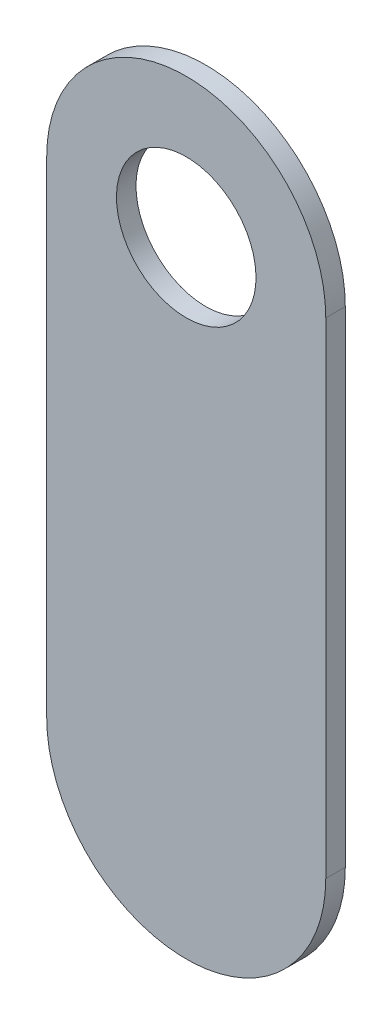
ISO-10303-21;
HEADER;
FILE_DESCRIPTION(('STEP AP214'),'2;1');
FILE_NAME('part.step','',(''),(''),'','','');
FILE_SCHEMA(('AUTOMOTIVE_DESIGN { 1 0 10303 214 1 1 1 1 }'));
ENDSEC;
DATA;
#1=APPLICATION_CONTEXT('core data for automotive mechanical design processes');
#2=APPLICATION_PROTOCOL_DEFINITION('international standard','automotive_design',2000,#1);
#3=PRODUCT_CONTEXT('',#1,'mechanical');
#4=PRODUCT('Part','Part','',(#3));
#5=PRODUCT_RELATED_PRODUCT_CATEGORY('part','',(#4));
#6=PRODUCT_DEFINITION_FORMATION('','',#4);
#7=PRODUCT_DEFINITION_CONTEXT('part definition',#1,'design');
#8=PRODUCT_DEFINITION('design','',#6,#7);
#9=PRODUCT_DEFINITION_SHAPE('','',#8);
#10=(LENGTH_UNIT() NAMED_UNIT(*) SI_UNIT(.MILLI.,.METRE.));
#11=(NAMED_UNIT(*) PLANE_ANGLE_UNIT() SI_UNIT($,.RADIAN.));
#12=(NAMED_UNIT(*) SI_UNIT($,.STERADIAN.) SOLID_ANGLE_UNIT());
#13=UNCERTAINTY_MEASURE_WITH_UNIT(LENGTH_MEASURE(1.E-05),#10,'distance_accuracy_value','');
#14=(GEOMETRIC_REPRESENTATION_CONTEXT(3) GLOBAL_UNCERTAINTY_ASSIGNED_CONTEXT((#13)) GLOBAL_UNIT_ASSIGNED_CONTEXT((#10,
#11,#12)) REPRESENTATION_CONTEXT('',''));
#15=CARTESIAN_POINT('',(0.,0.,0.));
#16=DIRECTION('',(0.,0.,1.));
#17=DIRECTION('',(1.,0.,0.));
#18=AXIS2_PLACEMENT_3D('',#15,#16,#17);
#19=CARTESIAN_POINT('',(89.9,-133.5,-0.045));
#20=DIRECTION('',(0.,0.,-1.));
#21=DIRECTION('',(0.,-1.,0.));
#22=AXIS2_PLACEMENT_3D('',#19,#20,#21);
#23=CYLINDRICAL_SURFACE('',#22,0.125);
#24=CARTESIAN_POINT('',(89.9,-133.5,1.6));
#25=DIRECTION('',(0.,0.,-1.));
#26=DIRECTION('',(0.,-1.,0.));
#27=AXIS2_PLACEMENT_3D('',#24,#25,#26);
#28=CIRCLE('',#27,0.125);
#29=CARTESIAN_POINT('',(89.9,-133.625,1.6));
#30=VERTEX_POINT('',#29);
#31=EDGE_CURVE('E20',#30,#30,#28,.T.);
#32=ORIENTED_EDGE('',*,*,#31,.T.);
#33=DIRECTION('',(0.,0.,1.));
#34=VECTOR('',#33,1.);
#35=CARTESIAN_POINT('',(89.9,-133.625,-0.045));
#36=LINE('',#35,#34);
#37=CARTESIAN_POINT('',(89.9,-133.625,1.635));
#38=VERTEX_POINT('',#37);
#39=EDGE_CURVE('E11',#30,#38,#36,.T.);
#40=ORIENTED_EDGE('',*,*,#39,.T.);
#41=CARTESIAN_POINT('',(89.9,-133.5,1.635));
#42=DIRECTION('',(0.,0.,-1.));
#43=DIRECTION('',(0.,-1.,0.));
#44=AXIS2_PLACEMENT_3D('',#41,#42,#43);
#45=CIRCLE('',#44,0.125);
#46=EDGE_CURVE('E26',#38,#38,#45,.T.);
#47=ORIENTED_EDGE('',*,*,#46,.F.);
#48=ORIENTED_EDGE('',*,*,#39,.F.);
#49=EDGE_LOOP('',(#32,#40,#47,#48));
#50=FACE_BOUND('',#49,.T.);
#51=ADVANCED_FACE('F17',(#50),#23,.F.);
#52=CARTESIAN_POINT('',(89.65,-133.5,1.6));
#53=DIRECTION('',(1.,0.,0.));
#54=DIRECTION('',(0.,1.,0.));
#55=AXIS2_PLACEMENT_3D('',#52,#53,#54);
#56=PLANE('',#55);
#57=DIRECTION('',(0.,-1.,0.));
#58=VECTOR('',#57,1.);
#59=CARTESIAN_POINT('',(89.65,-133.5,1.6));
#60=LINE('',#59,#58);
#61=CARTESIAN_POINT('',(89.65,-133.5,1.6));
#62=VERTEX_POINT('',#61);
#63=CARTESIAN_POINT('',(89.65,-134.37,1.6));
#64=VERTEX_POINT('',#63);
#65=EDGE_CURVE('E76',#62,#64,#60,.T.);
#66=ORIENTED_EDGE('',*,*,#65,.T.);
#67=DIRECTION('',(0.,0.,1.));
#68=VECTOR('',#67,1.);
#69=CARTESIAN_POINT('',(89.65,-134.37,1.6));
#70=LINE('',#69,#68);
#71=CARTESIAN_POINT('',(89.65,-134.37,1.635));
#72=VERTEX_POINT('',#71);
#73=EDGE_CURVE('E103',#64,#72,#70,.T.);
#74=ORIENTED_EDGE('',*,*,#73,.T.);
#75=DIRECTION('',(0.,-1.,0.));
#76=VECTOR('',#75,1.);
#77=CARTESIAN_POINT('',(89.65,-133.5,1.635));
#78=LINE('',#77,#76);
#79=CARTESIAN_POINT('',(89.65,-133.5,1.635));
#80=VERTEX_POINT('',#79);
#81=EDGE_CURVE('E93',#80,#72,#78,.T.);
#82=ORIENTED_EDGE('',*,*,#81,.F.);
#83=DIRECTION('',(0.,0.,1.));
#84=VECTOR('',#83,1.);
#85=CARTESIAN_POINT('',(89.65,-133.5,1.6));
#86=LINE('',#85,#84);
#87=EDGE_CURVE('E91',#62,#80,#86,.T.);
#88=ORIENTED_EDGE('',*,*,#87,.F.);
#89=EDGE_LOOP('',(#66,#74,#82,#88));
#90=FACE_BOUND('',#89,.T.);
#91=ADVANCED_FACE('F92',(#90),#56,.F.);
#92=CARTESIAN_POINT('',(90.15,-134.37,1.635));
#93=DIRECTION('',(0.,0.,1.));
#94=DIRECTION('',(1.,0.,0.));
#95=AXIS2_PLACEMENT_3D('',#92,#93,#94);
#96=PLANE('',#95);
#97=ORIENTED_EDGE('',*,*,#46,.T.);
#98=EDGE_LOOP('',(#97));
#99=FACE_BOUND('',#98,.T.);
#100=DIRECTION('',(0.,1.,0.));
#101=VECTOR('',#100,1.);
#102=CARTESIAN_POINT('',(90.15,-134.37,1.635));
#103=LINE('',#102,#101);
#104=CARTESIAN_POINT('',(90.15,-134.37,1.635));
#105=VERTEX_POINT('',#104);
#106=CARTESIAN_POINT('',(90.15,-133.5,1.635));
#107=VERTEX_POINT('',#106);
#108=EDGE_CURVE('E162',#105,#107,#103,.T.);
#109=ORIENTED_EDGE('',*,*,#108,.T.);
#110=CARTESIAN_POINT('',(89.9,-133.5,1.635));
#111=DIRECTION('',(0.,0.,1.));
#112=DIRECTION('',(1.,0.,0.));
#113=AXIS2_PLACEMENT_3D('',#110,#111,#112);
#114=CIRCLE('',#113,0.25);
#115=EDGE_CURVE('E88',#107,#80,#114,.T.);
#116=ORIENTED_EDGE('',*,*,#115,.T.);
#117=ORIENTED_EDGE('',*,*,#81,.T.);
#118=CARTESIAN_POINT('',(89.9,-134.37,1.635));
#119=DIRECTION('',(0.,0.,1.));
#120=DIRECTION('',(-1.,0.,0.));
#121=AXIS2_PLACEMENT_3D('',#118,#119,#120);
#122=CIRCLE('',#121,0.25);
#123=EDGE_CURVE('E109',#72,#105,#122,.T.);
#124=ORIENTED_EDGE('',*,*,#123,.T.);
#125=EDGE_LOOP('',(#109,#116,#117,#124));
#126=FACE_BOUND('',#125,.T.);
#127=ADVANCED_FACE('F123',(#99,#126),#96,.T.);
#128=CARTESIAN_POINT('',(90.15,-134.37,1.6));
#129=DIRECTION('',(0.,0.,1.));
#130=DIRECTION('',(1.,0.,0.));
#131=AXIS2_PLACEMENT_3D('',#128,#129,#130);
#132=PLANE('',#131);
#133=ORIENTED_EDGE('',*,*,#31,.F.);
#134=EDGE_LOOP('',(#133));
#135=FACE_BOUND('',#134,.T.);
#136=CARTESIAN_POINT('',(89.9,-134.37,1.6));
#137=DIRECTION('',(0.,0.,1.));
#138=DIRECTION('',(-1.,0.,0.));
#139=AXIS2_PLACEMENT_3D('',#136,#137,#138);
#140=CIRCLE('',#139,0.25);
#141=CARTESIAN_POINT('',(90.15,-134.37,1.6));
#142=VERTEX_POINT('',#141);
#143=EDGE_CURVE('E83',#64,#142,#140,.T.);
#144=ORIENTED_EDGE('',*,*,#143,.F.);
#145=ORIENTED_EDGE('',*,*,#65,.F.);
#146=CARTESIAN_POINT('',(89.9,-133.5,1.6));
#147=DIRECTION('',(0.,0.,1.));
#148=DIRECTION('',(1.,0.,0.));
#149=AXIS2_PLACEMENT_3D('',#146,#147,#148);
#150=CIRCLE('',#149,0.25);
#151=CARTESIAN_POINT('',(90.15,-133.5,1.6));
#152=VERTEX_POINT('',#151);
#153=EDGE_CURVE('E81',#152,#62,#150,.T.);
#154=ORIENTED_EDGE('',*,*,#153,.F.);
#155=DIRECTION('',(0.,1.,0.));
#156=VECTOR('',#155,1.);
#157=CARTESIAN_POINT('',(90.15,-134.37,1.6));
#158=LINE('',#157,#156);
#159=EDGE_CURVE('E160',#142,#152,#158,.T.);
#160=ORIENTED_EDGE('',*,*,#159,.F.);
#161=EDGE_LOOP('',(#144,#145,#154,#160));
#162=FACE_BOUND('',#161,.T.);
#163=ADVANCED_FACE('F78',(#135,#162),#132,.F.);
#164=CARTESIAN_POINT('',(89.9,-133.5,1.6));
#165=DIRECTION('',(0.,0.,-1.));
#166=DIRECTION('',(1.,0.,0.));
#167=AXIS2_PLACEMENT_3D('',#164,#165,#166);
#168=CYLINDRICAL_SURFACE('',#167,0.25);
#169=ORIENTED_EDGE('',*,*,#153,.T.);
#170=ORIENTED_EDGE('',*,*,#87,.T.);
#171=ORIENTED_EDGE('',*,*,#115,.F.);
#172=DIRECTION('',(0.,0.,1.));
#173=VECTOR('',#172,1.);
#174=CARTESIAN_POINT('',(90.15,-133.5,1.6));
#175=LINE('',#174,#173);
#176=EDGE_CURVE('E100',#152,#107,#175,.T.);
#177=ORIENTED_EDGE('',*,*,#176,.F.);
#178=EDGE_LOOP('',(#169,#170,#171,#177));
#179=FACE_BOUND('',#178,.T.);
#180=ADVANCED_FACE('F98',(#179),#168,.T.);
#181=CARTESIAN_POINT('',(89.9,-134.37,1.6));
#182=DIRECTION('',(0.,0.,-1.));
#183=DIRECTION('',(-1.,0.,0.));
#184=AXIS2_PLACEMENT_3D('',#181,#182,#183);
#185=CYLINDRICAL_SURFACE('',#184,0.25);
#186=ORIENTED_EDGE('',*,*,#143,.T.);
#187=DIRECTION('',(0.,0.,1.));
#188=VECTOR('',#187,1.);
#189=CARTESIAN_POINT('',(90.15,-134.37,1.6));
#190=LINE('',#189,#188);
#191=EDGE_CURVE('E156',#142,#105,#190,.T.);
#192=ORIENTED_EDGE('',*,*,#191,.T.);
#193=ORIENTED_EDGE('',*,*,#123,.F.);
#194=ORIENTED_EDGE('',*,*,#73,.F.);
#195=EDGE_LOOP('',(#186,#192,#193,#194));
#196=FACE_BOUND('',#195,.T.);
#197=ADVANCED_FACE('F131',(#196),#185,.T.);
#198=CARTESIAN_POINT('',(90.15,-134.37,1.6));
#199=DIRECTION('',(-1.,0.,0.));
#200=DIRECTION('',(0.,0.,1.));
#201=AXIS2_PLACEMENT_3D('',#198,#199,#200);
#202=PLANE('',#201);
#203=ORIENTED_EDGE('',*,*,#159,.T.);
#204=ORIENTED_EDGE('',*,*,#176,.T.);
#205=ORIENTED_EDGE('',*,*,#108,.F.);
#206=ORIENTED_EDGE('',*,*,#191,.F.);
#207=EDGE_LOOP('',(#203,#204,#205,#206));
#208=FACE_BOUND('',#207,.T.);
#209=ADVANCED_FACE('F144',(#208),#202,.F.);
#210=CLOSED_SHELL('',(#51,#91,#127,#163,#180,#197,#209));
#211=MANIFOLD_SOLID_BREP('B1',#210);
#212=ADVANCED_BREP_SHAPE_REPRESENTATION('',(#18,#211),#14);
#213=SHAPE_DEFINITION_REPRESENTATION(#9,#212);
ENDSEC;
END-ISO-10303-21;
